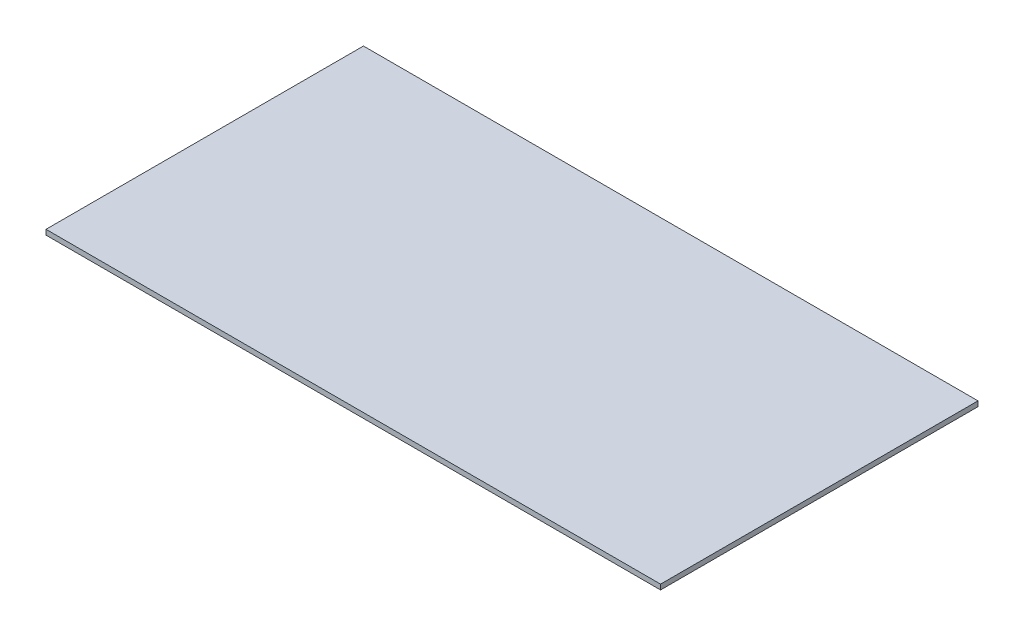
ISO-10303-21;
HEADER;
FILE_DESCRIPTION(('STEP AP214'),'2;1');
FILE_NAME('part.step','',(''),(''),'','','');
FILE_SCHEMA(('AUTOMOTIVE_DESIGN { 1 0 10303 214 1 1 1 1 }'));
ENDSEC;
DATA;
#1=APPLICATION_CONTEXT('core data for automotive mechanical design processes');
#2=APPLICATION_PROTOCOL_DEFINITION('international standard','automotive_design',2000,#1);
#3=PRODUCT_CONTEXT('',#1,'mechanical');
#4=PRODUCT('Part','Part','',(#3));
#5=PRODUCT_RELATED_PRODUCT_CATEGORY('part','',(#4));
#6=PRODUCT_DEFINITION_FORMATION('','',#4);
#7=PRODUCT_DEFINITION_CONTEXT('part definition',#1,'design');
#8=PRODUCT_DEFINITION('design','',#6,#7);
#9=PRODUCT_DEFINITION_SHAPE('','',#8);
#10=(LENGTH_UNIT() NAMED_UNIT(*) SI_UNIT(.MILLI.,.METRE.));
#11=(NAMED_UNIT(*) PLANE_ANGLE_UNIT() SI_UNIT($,.RADIAN.));
#12=(NAMED_UNIT(*) SI_UNIT($,.STERADIAN.) SOLID_ANGLE_UNIT());
#13=UNCERTAINTY_MEASURE_WITH_UNIT(LENGTH_MEASURE(1.E-05),#10,'distance_accuracy_value','');
#14=(GEOMETRIC_REPRESENTATION_CONTEXT(3) GLOBAL_UNCERTAINTY_ASSIGNED_CONTEXT((#13)) GLOBAL_UNIT_ASSIGNED_CONTEXT((#10,
#11,#12)) REPRESENTATION_CONTEXT('',''));
#15=CARTESIAN_POINT('',(0.,0.,0.));
#16=DIRECTION('',(0.,0.,1.));
#17=DIRECTION('',(1.,0.,0.));
#18=AXIS2_PLACEMENT_3D('',#15,#16,#17);
#19=CARTESIAN_POINT('',(0.,2.,0.));
#20=DIRECTION('',(1.,0.,0.));
#21=DIRECTION('',(0.,0.,-1.));
#22=AXIS2_PLACEMENT_3D('',#19,#20,#21);
#23=PLANE('',#22);
#24=DIRECTION('',(0.,0.,1.));
#25=VECTOR('',#24,1.);
#26=CARTESIAN_POINT('',(0.,0.,0.));
#27=LINE('',#26,#25);
#28=CARTESIAN_POINT('',(0.,0.,-125.));
#29=VERTEX_POINT('',#28);
#30=CARTESIAN_POINT('',(0.,0.,0.));
#31=VERTEX_POINT('',#30);
#32=EDGE_CURVE('E107',#29,#31,#27,.T.);
#33=ORIENTED_EDGE('',*,*,#32,.T.);
#34=DIRECTION('',(0.,-1.,0.));
#35=VECTOR('',#34,1.);
#36=CARTESIAN_POINT('',(0.,2.,0.));
#37=LINE('',#36,#35);
#38=CARTESIAN_POINT('',(0.,2.,0.));
#39=VERTEX_POINT('',#38);
#40=EDGE_CURVE('E11',#39,#31,#37,.T.);
#41=ORIENTED_EDGE('',*,*,#40,.F.);
#42=DIRECTION('',(0.,0.,1.));
#43=VECTOR('',#42,1.);
#44=CARTESIAN_POINT('',(0.,2.,0.));
#45=LINE('',#44,#43);
#46=CARTESIAN_POINT('',(0.,2.,-125.));
#47=VERTEX_POINT('',#46);
#48=EDGE_CURVE('E91',#47,#39,#45,.T.);
#49=ORIENTED_EDGE('',*,*,#48,.F.);
#50=DIRECTION('',(0.,-1.,0.));
#51=VECTOR('',#50,1.);
#52=CARTESIAN_POINT('',(0.,2.,-125.));
#53=LINE('',#52,#51);
#54=EDGE_CURVE('E103',#47,#29,#53,.T.);
#55=ORIENTED_EDGE('',*,*,#54,.T.);
#56=EDGE_LOOP('',(#33,#41,#49,#55));
#57=FACE_BOUND('',#56,.T.);
#58=ADVANCED_FACE('F39',(#57),#23,.F.);
#59=CARTESIAN_POINT('',(0.,2.,0.));
#60=DIRECTION('',(0.,0.,-1.));
#61=DIRECTION('',(-1.,0.,0.));
#62=AXIS2_PLACEMENT_3D('',#59,#60,#61);
#63=PLANE('',#62);
#64=DIRECTION('',(1.,0.,0.));
#65=VECTOR('',#64,1.);
#66=CARTESIAN_POINT('',(0.,0.,0.));
#67=LINE('',#66,#65);
#68=CARTESIAN_POINT('',(242.,0.,0.));
#69=VERTEX_POINT('',#68);
#70=EDGE_CURVE('E96',#31,#69,#67,.T.);
#71=ORIENTED_EDGE('',*,*,#70,.T.);
#72=DIRECTION('',(0.,-1.,0.));
#73=VECTOR('',#72,1.);
#74=CARTESIAN_POINT('',(242.,2.,0.));
#75=LINE('',#74,#73);
#76=CARTESIAN_POINT('',(242.,2.,0.));
#77=VERTEX_POINT('',#76);
#78=EDGE_CURVE('E48',#77,#69,#75,.T.);
#79=ORIENTED_EDGE('',*,*,#78,.F.);
#80=DIRECTION('',(1.,0.,0.));
#81=VECTOR('',#80,1.);
#82=CARTESIAN_POINT('',(0.,2.,0.));
#83=LINE('',#82,#81);
#84=EDGE_CURVE('E86',#39,#77,#83,.T.);
#85=ORIENTED_EDGE('',*,*,#84,.F.);
#86=ORIENTED_EDGE('',*,*,#40,.T.);
#87=EDGE_LOOP('',(#71,#79,#85,#86));
#88=FACE_BOUND('',#87,.T.);
#89=ADVANCED_FACE('F95',(#88),#63,.F.);
#90=CARTESIAN_POINT('',(242.,2.,0.));
#91=DIRECTION('',(-1.,0.,0.));
#92=DIRECTION('',(0.,0.,1.));
#93=AXIS2_PLACEMENT_3D('',#90,#91,#92);
#94=PLANE('',#93);
#95=DIRECTION('',(0.,0.,-1.));
#96=VECTOR('',#95,1.);
#97=CARTESIAN_POINT('',(242.,0.,0.));
#98=LINE('',#97,#96);
#99=CARTESIAN_POINT('',(242.,0.,-125.));
#100=VERTEX_POINT('',#99);
#101=EDGE_CURVE('E73',#69,#100,#98,.T.);
#102=ORIENTED_EDGE('',*,*,#101,.T.);
#103=DIRECTION('',(0.,-1.,0.));
#104=VECTOR('',#103,1.);
#105=CARTESIAN_POINT('',(242.,2.,-125.));
#106=LINE('',#105,#104);
#107=CARTESIAN_POINT('',(242.,2.,-125.));
#108=VERTEX_POINT('',#107);
#109=EDGE_CURVE('E98',#108,#100,#106,.T.);
#110=ORIENTED_EDGE('',*,*,#109,.F.);
#111=DIRECTION('',(0.,0.,-1.));
#112=VECTOR('',#111,1.);
#113=CARTESIAN_POINT('',(242.,2.,0.));
#114=LINE('',#113,#112);
#115=EDGE_CURVE('E89',#77,#108,#114,.T.);
#116=ORIENTED_EDGE('',*,*,#115,.F.);
#117=ORIENTED_EDGE('',*,*,#78,.T.);
#118=EDGE_LOOP('',(#102,#110,#116,#117));
#119=FACE_BOUND('',#118,.T.);
#120=ADVANCED_FACE('F99',(#119),#94,.F.);
#121=CARTESIAN_POINT('',(0.,2.,-125.));
#122=DIRECTION('',(0.,0.,1.));
#123=DIRECTION('',(1.,0.,0.));
#124=AXIS2_PLACEMENT_3D('',#121,#122,#123);
#125=PLANE('',#124);
#126=DIRECTION('',(-1.,0.,0.));
#127=VECTOR('',#126,1.);
#128=CARTESIAN_POINT('',(0.,0.,-125.));
#129=LINE('',#128,#127);
#130=EDGE_CURVE('E79',#100,#29,#129,.T.);
#131=ORIENTED_EDGE('',*,*,#130,.T.);
#132=ORIENTED_EDGE('',*,*,#54,.F.);
#133=DIRECTION('',(-1.,0.,0.));
#134=VECTOR('',#133,1.);
#135=CARTESIAN_POINT('',(0.,2.,-125.));
#136=LINE('',#135,#134);
#137=EDGE_CURVE('E56',#108,#47,#136,.T.);
#138=ORIENTED_EDGE('',*,*,#137,.F.);
#139=ORIENTED_EDGE('',*,*,#109,.T.);
#140=EDGE_LOOP('',(#131,#132,#138,#139));
#141=FACE_BOUND('',#140,.T.);
#142=ADVANCED_FACE('F120',(#141),#125,.F.);
#143=CARTESIAN_POINT('',(0.,2.,0.));
#144=DIRECTION('',(0.,-1.,0.));
#145=DIRECTION('',(0.,0.,-1.));
#146=AXIS2_PLACEMENT_3D('',#143,#144,#145);
#147=PLANE('',#146);
#148=ORIENTED_EDGE('',*,*,#48,.T.);
#149=ORIENTED_EDGE('',*,*,#84,.T.);
#150=ORIENTED_EDGE('',*,*,#115,.T.);
#151=ORIENTED_EDGE('',*,*,#137,.T.);
#152=EDGE_LOOP('',(#148,#149,#150,#151));
#153=FACE_BOUND('',#152,.T.);
#154=ADVANCED_FACE('F87',(#153),#147,.F.);
#155=CARTESIAN_POINT('',(0.,0.,0.));
#156=DIRECTION('',(0.,-1.,0.));
#157=DIRECTION('',(0.,0.,-1.));
#158=AXIS2_PLACEMENT_3D('',#155,#156,#157);
#159=PLANE('',#158);
#160=ORIENTED_EDGE('',*,*,#32,.F.);
#161=ORIENTED_EDGE('',*,*,#130,.F.);
#162=ORIENTED_EDGE('',*,*,#101,.F.);
#163=ORIENTED_EDGE('',*,*,#70,.F.);
#164=EDGE_LOOP('',(#160,#161,#162,#163));
#165=FACE_BOUND('',#164,.T.);
#166=ADVANCED_FACE('F123',(#165),#159,.T.);
#167=CLOSED_SHELL('',(#58,#89,#120,#142,#154,#166));
#168=MANIFOLD_SOLID_BREP('B2',#167);
#169=ADVANCED_BREP_SHAPE_REPRESENTATION('',(#18,#168),#14);
#170=SHAPE_DEFINITION_REPRESENTATION(#9,#169);
ENDSEC;
END-ISO-10303-21;
